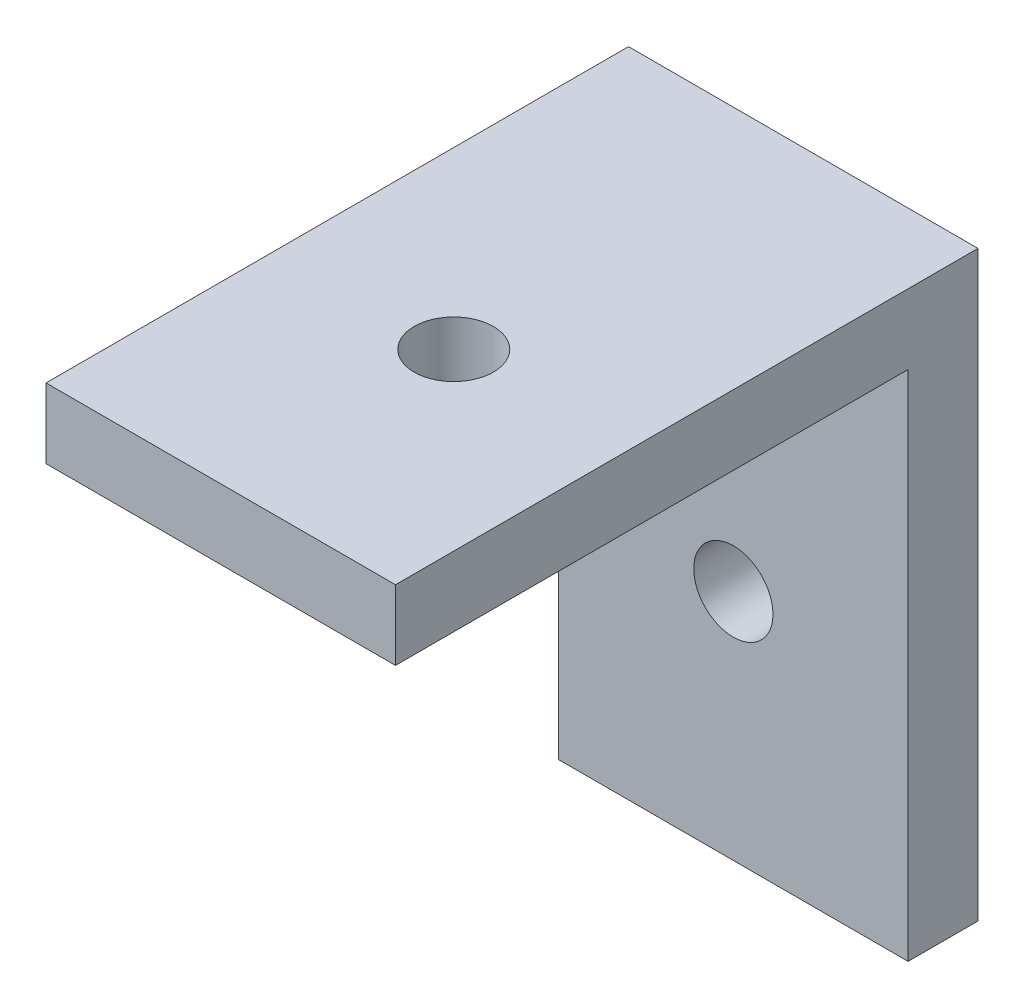
ISO-10303-21;
HEADER;
FILE_DESCRIPTION(('STEP AP214'),'2;1');
FILE_NAME('part.step','',(''),(''),'','','');
FILE_SCHEMA(('AUTOMOTIVE_DESIGN { 1 0 10303 214 1 1 1 1 }'));
ENDSEC;
DATA;
#1=APPLICATION_CONTEXT('core data for automotive mechanical design processes');
#2=APPLICATION_PROTOCOL_DEFINITION('international standard','automotive_design',2000,#1);
#3=PRODUCT_CONTEXT('',#1,'mechanical');
#4=PRODUCT('Part','Part','',(#3));
#5=PRODUCT_RELATED_PRODUCT_CATEGORY('part','',(#4));
#6=PRODUCT_DEFINITION_FORMATION('','',#4);
#7=PRODUCT_DEFINITION_CONTEXT('part definition',#1,'design');
#8=PRODUCT_DEFINITION('design','',#6,#7);
#9=PRODUCT_DEFINITION_SHAPE('','',#8);
#10=(LENGTH_UNIT() NAMED_UNIT(*) SI_UNIT(.MILLI.,.METRE.));
#11=(NAMED_UNIT(*) PLANE_ANGLE_UNIT() SI_UNIT($,.RADIAN.));
#12=(NAMED_UNIT(*) SI_UNIT($,.STERADIAN.) SOLID_ANGLE_UNIT());
#13=UNCERTAINTY_MEASURE_WITH_UNIT(LENGTH_MEASURE(1.E-05),#10,'distance_accuracy_value','');
#14=(GEOMETRIC_REPRESENTATION_CONTEXT(3) GLOBAL_UNCERTAINTY_ASSIGNED_CONTEXT((#13)) GLOBAL_UNIT_ASSIGNED_CONTEXT((#10,
#11,#12)) REPRESENTATION_CONTEXT('',''));
#15=CARTESIAN_POINT('',(0.,0.,0.));
#16=DIRECTION('',(0.,0.,1.));
#17=DIRECTION('',(1.,0.,0.));
#18=AXIS2_PLACEMENT_3D('',#15,#16,#17);
#19=CARTESIAN_POINT('',(0.,0.,3.));
#20=DIRECTION('',(0.,0.,-1.));
#21=DIRECTION('',(-1.,0.,0.));
#22=AXIS2_PLACEMENT_3D('',#19,#20,#21);
#23=PLANE('',#22);
#24=CARTESIAN_POINT('',(0.,-15.,3.));
#25=DIRECTION('',(0.,0.,1.));
#26=DIRECTION('',(1.,0.,0.));
#27=AXIS2_PLACEMENT_3D('',#24,#25,#26);
#28=CIRCLE('',#27,1.7);
#29=CARTESIAN_POINT('',(1.7,-15.,3.));
#30=VERTEX_POINT('',#29);
#31=EDGE_CURVE('E146',#30,#30,#28,.T.);
#32=ORIENTED_EDGE('',*,*,#31,.F.);
#33=EDGE_LOOP('',(#32));
#34=FACE_BOUND('',#33,.T.);
#35=DIRECTION('',(1.,0.,0.));
#36=VECTOR('',#35,1.);
#37=CARTESIAN_POINT('',(0.,-3.,3.));
#38=LINE('',#37,#36);
#39=CARTESIAN_POINT('',(-7.5,-3.,3.));
#40=VERTEX_POINT('',#39);
#41=CARTESIAN_POINT('',(7.5,-3.,3.));
#42=VERTEX_POINT('',#41);
#43=EDGE_CURVE('E11',#40,#42,#38,.T.);
#44=ORIENTED_EDGE('',*,*,#43,.F.);
#45=DIRECTION('',(0.,-1.,0.));
#46=VECTOR('',#45,1.);
#47=CARTESIAN_POINT('',(-7.5,-25.,3.));
#48=LINE('',#47,#46);
#49=CARTESIAN_POINT('',(-7.5,-25.,3.));
#50=VERTEX_POINT('',#49);
#51=EDGE_CURVE('E98',#40,#50,#48,.T.);
#52=ORIENTED_EDGE('',*,*,#51,.T.);
#53=DIRECTION('',(1.,0.,0.));
#54=VECTOR('',#53,1.);
#55=CARTESIAN_POINT('',(-7.5,-25.,3.));
#56=LINE('',#55,#54);
#57=CARTESIAN_POINT('',(7.5,-25.,3.));
#58=VERTEX_POINT('',#57);
#59=EDGE_CURVE('E62',#50,#58,#56,.T.);
#60=ORIENTED_EDGE('',*,*,#59,.T.);
#61=DIRECTION('',(0.,1.,0.));
#62=VECTOR('',#61,1.);
#63=CARTESIAN_POINT('',(7.5,-25.,3.));
#64=LINE('',#63,#62);
#65=EDGE_CURVE('E109',#58,#42,#64,.T.);
#66=ORIENTED_EDGE('',*,*,#65,.T.);
#67=EDGE_LOOP('',(#44,#52,#60,#66));
#68=FACE_BOUND('',#67,.T.);
#69=ADVANCED_FACE('F44',(#34,#68),#23,.F.);
#70=CARTESIAN_POINT('',(-7.5,-25.,3.));
#71=DIRECTION('',(1.,0.,0.));
#72=DIRECTION('',(0.,0.,-1.));
#73=AXIS2_PLACEMENT_3D('',#70,#71,#72);
#74=PLANE('',#73);
#75=DIRECTION('',(0.,-1.,0.));
#76=VECTOR('',#75,1.);
#77=CARTESIAN_POINT('',(-7.5,-25.,0.));
#78=LINE('',#77,#76);
#79=CARTESIAN_POINT('',(-7.5,0.,0.));
#80=VERTEX_POINT('',#79);
#81=CARTESIAN_POINT('',(-7.5,-25.,0.));
#82=VERTEX_POINT('',#81);
#83=EDGE_CURVE('E102',#80,#82,#78,.T.);
#84=ORIENTED_EDGE('',*,*,#83,.T.);
#85=DIRECTION('',(0.,0.,-1.));
#86=VECTOR('',#85,1.);
#87=CARTESIAN_POINT('',(-7.5,-25.,3.));
#88=LINE('',#87,#86);
#89=EDGE_CURVE('E53',#50,#82,#88,.T.);
#90=ORIENTED_EDGE('',*,*,#89,.F.);
#91=ORIENTED_EDGE('',*,*,#51,.F.);
#92=DIRECTION('',(0.,0.,1.));
#93=VECTOR('',#92,1.);
#94=CARTESIAN_POINT('',(-7.5,-3.,0.));
#95=LINE('',#94,#93);
#96=CARTESIAN_POINT('',(-7.5,-3.,25.));
#97=VERTEX_POINT('',#96);
#98=EDGE_CURVE('E140',#40,#97,#95,.T.);
#99=ORIENTED_EDGE('',*,*,#98,.T.);
#100=DIRECTION('',(0.,-1.,0.));
#101=VECTOR('',#100,1.);
#102=CARTESIAN_POINT('',(-7.5,0.,25.));
#103=LINE('',#102,#101);
#104=CARTESIAN_POINT('',(-7.5,0.,25.));
#105=VERTEX_POINT('',#104);
#106=EDGE_CURVE('E107',#105,#97,#103,.T.);
#107=ORIENTED_EDGE('',*,*,#106,.F.);
#108=DIRECTION('',(0.,0.,-1.));
#109=VECTOR('',#108,1.);
#110=CARTESIAN_POINT('',(-7.5,0.,3.));
#111=LINE('',#110,#109);
#112=EDGE_CURVE('E89',#105,#80,#111,.T.);
#113=ORIENTED_EDGE('',*,*,#112,.T.);
#114=EDGE_LOOP('',(#84,#90,#91,#99,#107,#113));
#115=FACE_BOUND('',#114,.T.);
#116=ADVANCED_FACE('F50',(#115),#74,.F.);
#117=CARTESIAN_POINT('',(-7.5,-25.,3.));
#118=DIRECTION('',(0.,1.,0.));
#119=DIRECTION('',(0.,0.,1.));
#120=AXIS2_PLACEMENT_3D('',#117,#118,#119);
#121=PLANE('',#120);
#122=DIRECTION('',(1.,0.,0.));
#123=VECTOR('',#122,1.);
#124=CARTESIAN_POINT('',(-7.5,-25.,0.));
#125=LINE('',#124,#123);
#126=CARTESIAN_POINT('',(7.5,-25.,0.));
#127=VERTEX_POINT('',#126);
#128=EDGE_CURVE('E114',#82,#127,#125,.T.);
#129=ORIENTED_EDGE('',*,*,#128,.T.);
#130=DIRECTION('',(0.,0.,-1.));
#131=VECTOR('',#130,1.);
#132=CARTESIAN_POINT('',(7.5,-25.,3.));
#133=LINE('',#132,#131);
#134=EDGE_CURVE('E129',#58,#127,#133,.T.);
#135=ORIENTED_EDGE('',*,*,#134,.F.);
#136=ORIENTED_EDGE('',*,*,#59,.F.);
#137=ORIENTED_EDGE('',*,*,#89,.T.);
#138=EDGE_LOOP('',(#129,#135,#136,#137));
#139=FACE_BOUND('',#138,.T.);
#140=ADVANCED_FACE('F134',(#139),#121,.F.);
#141=CARTESIAN_POINT('',(7.5,-25.,3.));
#142=DIRECTION('',(-1.,0.,0.));
#143=DIRECTION('',(0.,0.,1.));
#144=AXIS2_PLACEMENT_3D('',#141,#142,#143);
#145=PLANE('',#144);
#146=DIRECTION('',(0.,0.,-1.));
#147=VECTOR('',#146,1.);
#148=CARTESIAN_POINT('',(7.5,0.,3.));
#149=LINE('',#148,#147);
#150=CARTESIAN_POINT('',(7.5,0.,25.));
#151=VERTEX_POINT('',#150);
#152=CARTESIAN_POINT('',(7.5,0.,0.));
#153=VERTEX_POINT('',#152);
#154=EDGE_CURVE('E91',#151,#153,#149,.T.);
#155=ORIENTED_EDGE('',*,*,#154,.F.);
#156=DIRECTION('',(0.,-1.,0.));
#157=VECTOR('',#156,1.);
#158=CARTESIAN_POINT('',(7.5,0.,25.));
#159=LINE('',#158,#157);
#160=CARTESIAN_POINT('',(7.5,-3.,25.));
#161=VERTEX_POINT('',#160);
#162=EDGE_CURVE('E117',#151,#161,#159,.T.);
#163=ORIENTED_EDGE('',*,*,#162,.T.);
#164=DIRECTION('',(0.,0.,-1.));
#165=VECTOR('',#164,1.);
#166=CARTESIAN_POINT('',(7.5,-3.,0.));
#167=LINE('',#166,#165);
#168=EDGE_CURVE('E155',#161,#42,#167,.T.);
#169=ORIENTED_EDGE('',*,*,#168,.T.);
#170=ORIENTED_EDGE('',*,*,#65,.F.);
#171=ORIENTED_EDGE('',*,*,#134,.T.);
#172=DIRECTION('',(0.,1.,0.));
#173=VECTOR('',#172,1.);
#174=CARTESIAN_POINT('',(7.5,-25.,0.));
#175=LINE('',#174,#173);
#176=EDGE_CURVE('E97',#127,#153,#175,.T.);
#177=ORIENTED_EDGE('',*,*,#176,.T.);
#178=EDGE_LOOP('',(#155,#163,#169,#170,#171,#177));
#179=FACE_BOUND('',#178,.T.);
#180=ADVANCED_FACE('F168',(#179),#145,.F.);
#181=CARTESIAN_POINT('',(-7.5,0.,3.));
#182=DIRECTION('',(0.,-1.,0.));
#183=DIRECTION('',(0.,0.,-1.));
#184=AXIS2_PLACEMENT_3D('',#181,#182,#183);
#185=PLANE('',#184);
#186=CARTESIAN_POINT('',(0.,0.,15.));
#187=DIRECTION('',(0.,1.,0.));
#188=DIRECTION('',(0.,0.,1.));
#189=AXIS2_PLACEMENT_3D('',#186,#187,#188);
#190=CIRCLE('',#189,1.7);
#191=CARTESIAN_POINT('',(0.,0.,16.7));
#192=VERTEX_POINT('',#191);
#193=EDGE_CURVE('E262',#192,#192,#190,.T.);
#194=ORIENTED_EDGE('',*,*,#193,.F.);
#195=EDGE_LOOP('',(#194));
#196=FACE_BOUND('',#195,.T.);
#197=DIRECTION('',(-1.,0.,0.));
#198=VECTOR('',#197,1.);
#199=CARTESIAN_POINT('',(-7.5,0.,0.));
#200=LINE('',#199,#198);
#201=EDGE_CURVE('E82',#153,#80,#200,.T.);
#202=ORIENTED_EDGE('',*,*,#201,.T.);
#203=ORIENTED_EDGE('',*,*,#112,.F.);
#204=DIRECTION('',(1.,0.,0.));
#205=VECTOR('',#204,1.);
#206=CARTESIAN_POINT('',(-7.5,0.,25.));
#207=LINE('',#206,#205);
#208=EDGE_CURVE('E158',#105,#151,#207,.T.);
#209=ORIENTED_EDGE('',*,*,#208,.T.);
#210=ORIENTED_EDGE('',*,*,#154,.T.);
#211=EDGE_LOOP('',(#202,#203,#209,#210));
#212=FACE_BOUND('',#211,.T.);
#213=ADVANCED_FACE('F87',(#196,#212),#185,.F.);
#214=CARTESIAN_POINT('',(0.,0.,0.));
#215=DIRECTION('',(0.,0.,-1.));
#216=DIRECTION('',(-1.,0.,0.));
#217=AXIS2_PLACEMENT_3D('',#214,#215,#216);
#218=PLANE('',#217);
#219=CARTESIAN_POINT('',(0.,-15.,0.));
#220=DIRECTION('',(0.,0.,1.));
#221=DIRECTION('',(1.,0.,0.));
#222=AXIS2_PLACEMENT_3D('',#219,#220,#221);
#223=CIRCLE('',#222,1.7);
#224=CARTESIAN_POINT('',(1.7,-15.,0.));
#225=VERTEX_POINT('',#224);
#226=EDGE_CURVE('E154',#225,#225,#223,.T.);
#227=ORIENTED_EDGE('',*,*,#226,.T.);
#228=EDGE_LOOP('',(#227));
#229=FACE_BOUND('',#228,.T.);
#230=ORIENTED_EDGE('',*,*,#128,.F.);
#231=ORIENTED_EDGE('',*,*,#83,.F.);
#232=ORIENTED_EDGE('',*,*,#201,.F.);
#233=ORIENTED_EDGE('',*,*,#176,.F.);
#234=EDGE_LOOP('',(#230,#231,#232,#233));
#235=FACE_BOUND('',#234,.T.);
#236=ADVANCED_FACE('F115',(#229,#235),#218,.T.);
#237=CARTESIAN_POINT('',(0.,-3.,0.));
#238=DIRECTION('',(0.,1.,0.));
#239=DIRECTION('',(0.,0.,1.));
#240=AXIS2_PLACEMENT_3D('',#237,#238,#239);
#241=PLANE('',#240);
#242=CARTESIAN_POINT('',(0.,-3.,15.));
#243=DIRECTION('',(0.,1.,0.));
#244=DIRECTION('',(0.,0.,1.));
#245=AXIS2_PLACEMENT_3D('',#242,#243,#244);
#246=CIRCLE('',#245,1.7);
#247=CARTESIAN_POINT('',(0.,-3.,16.7));
#248=VERTEX_POINT('',#247);
#249=EDGE_CURVE('E270',#248,#248,#246,.T.);
#250=ORIENTED_EDGE('',*,*,#249,.T.);
#251=EDGE_LOOP('',(#250));
#252=FACE_BOUND('',#251,.T.);
#253=ORIENTED_EDGE('',*,*,#98,.F.);
#254=ORIENTED_EDGE('',*,*,#43,.T.);
#255=ORIENTED_EDGE('',*,*,#168,.F.);
#256=DIRECTION('',(1.,0.,0.));
#257=VECTOR('',#256,1.);
#258=CARTESIAN_POINT('',(-7.5,-3.,25.));
#259=LINE('',#258,#257);
#260=EDGE_CURVE('E148',#97,#161,#259,.T.);
#261=ORIENTED_EDGE('',*,*,#260,.F.);
#262=EDGE_LOOP('',(#253,#254,#255,#261));
#263=FACE_BOUND('',#262,.T.);
#264=ADVANCED_FACE('F142',(#252,#263),#241,.F.);
#265=CARTESIAN_POINT('',(-7.5,0.,25.));
#266=DIRECTION('',(0.,0.,-1.));
#267=DIRECTION('',(-1.,0.,0.));
#268=AXIS2_PLACEMENT_3D('',#265,#266,#267);
#269=PLANE('',#268);
#270=ORIENTED_EDGE('',*,*,#260,.T.);
#271=ORIENTED_EDGE('',*,*,#162,.F.);
#272=ORIENTED_EDGE('',*,*,#208,.F.);
#273=ORIENTED_EDGE('',*,*,#106,.T.);
#274=EDGE_LOOP('',(#270,#271,#272,#273));
#275=FACE_BOUND('',#274,.T.);
#276=ADVANCED_FACE('F179',(#275),#269,.F.);
#277=CARTESIAN_POINT('',(0.,-15.,3.));
#278=DIRECTION('',(0.,0.,-1.));
#279=DIRECTION('',(-1.,0.,0.));
#280=AXIS2_PLACEMENT_3D('',#277,#278,#279);
#281=CYLINDRICAL_SURFACE('',#280,1.7);
#282=ORIENTED_EDGE('',*,*,#31,.T.);
#283=EDGE_LOOP('',(#282));
#284=FACE_BOUND('',#283,.T.);
#285=ORIENTED_EDGE('',*,*,#226,.F.);
#286=EDGE_LOOP('',(#285));
#287=FACE_BOUND('',#286,.T.);
#288=ADVANCED_FACE('F182',(#284,#287),#281,.F.);
#289=CARTESIAN_POINT('',(0.,0.,15.));
#290=DIRECTION('',(0.,-1.,0.));
#291=DIRECTION('',(0.,0.,-1.));
#292=AXIS2_PLACEMENT_3D('',#289,#290,#291);
#293=CYLINDRICAL_SURFACE('',#292,1.7);
#294=ORIENTED_EDGE('',*,*,#193,.T.);
#295=EDGE_LOOP('',(#294));
#296=FACE_BOUND('',#295,.T.);
#297=ORIENTED_EDGE('',*,*,#249,.F.);
#298=EDGE_LOOP('',(#297));
#299=FACE_BOUND('',#298,.T.);
#300=ADVANCED_FACE('F186',(#296,#299),#293,.F.);
#301=CLOSED_SHELL('',(#69,#116,#140,#180,#213,#236,#264,#276,#288,#300));
#302=MANIFOLD_SOLID_BREP('B2',#301);
#303=ADVANCED_BREP_SHAPE_REPRESENTATION('',(#18,#302),#14);
#304=SHAPE_DEFINITION_REPRESENTATION(#9,#303);
ENDSEC;
END-ISO-10303-21;
